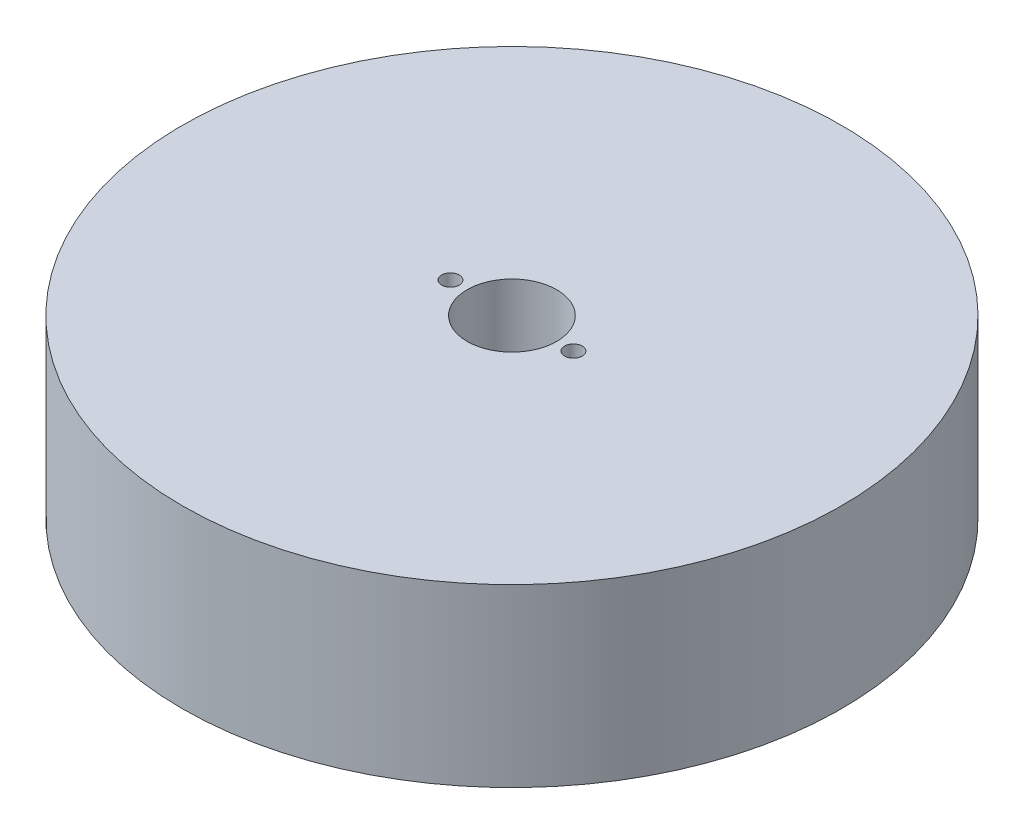
ISO-10303-21;
HEADER;
FILE_DESCRIPTION(('STEP AP214'),'2;1');
FILE_NAME('part.step','',(''),(''),'','','');
FILE_SCHEMA(('AUTOMOTIVE_DESIGN { 1 0 10303 214 1 1 1 1 }'));
ENDSEC;
DATA;
#1=APPLICATION_CONTEXT('core data for automotive mechanical design processes');
#2=APPLICATION_PROTOCOL_DEFINITION('international standard','automotive_design',2000,#1);
#3=PRODUCT_CONTEXT('',#1,'mechanical');
#4=PRODUCT('Part','Part','',(#3));
#5=PRODUCT_RELATED_PRODUCT_CATEGORY('part','',(#4));
#6=PRODUCT_DEFINITION_FORMATION('','',#4);
#7=PRODUCT_DEFINITION_CONTEXT('part definition',#1,'design');
#8=PRODUCT_DEFINITION('design','',#6,#7);
#9=PRODUCT_DEFINITION_SHAPE('','',#8);
#10=(LENGTH_UNIT() NAMED_UNIT(*) SI_UNIT(.MILLI.,.METRE.));
#11=(NAMED_UNIT(*) PLANE_ANGLE_UNIT() SI_UNIT($,.RADIAN.));
#12=(NAMED_UNIT(*) SI_UNIT($,.STERADIAN.) SOLID_ANGLE_UNIT());
#13=UNCERTAINTY_MEASURE_WITH_UNIT(LENGTH_MEASURE(1.E-05),#10,'distance_accuracy_value','');
#14=(GEOMETRIC_REPRESENTATION_CONTEXT(3) GLOBAL_UNCERTAINTY_ASSIGNED_CONTEXT((#13)) GLOBAL_UNIT_ASSIGNED_CONTEXT((#10,
#11,#12)) REPRESENTATION_CONTEXT('',''));
#15=CARTESIAN_POINT('',(0.,0.,0.));
#16=DIRECTION('',(0.,0.,1.));
#17=DIRECTION('',(1.,0.,0.));
#18=AXIS2_PLACEMENT_3D('',#15,#16,#17);
#19=CARTESIAN_POINT('',(0.,20.,0.));
#20=DIRECTION('',(0.,1.,0.));
#21=DIRECTION('',(0.,0.,1.));
#22=AXIS2_PLACEMENT_3D('',#19,#20,#21);
#23=PLANE('',#22);
#24=CARTESIAN_POINT('',(-7.,20.,0.));
#25=DIRECTION('',(0.,1.,0.));
#26=DIRECTION('',(0.,0.,1.));
#27=AXIS2_PLACEMENT_3D('',#24,#25,#26);
#28=CIRCLE('',#27,1.);
#29=CARTESIAN_POINT('',(-7.,20.,1.));
#30=VERTEX_POINT('',#29);
#31=EDGE_CURVE('E73',#30,#30,#28,.T.);
#32=ORIENTED_EDGE('',*,*,#31,.F.);
#33=EDGE_LOOP('',(#32));
#34=FACE_BOUND('',#33,.T.);
#35=CARTESIAN_POINT('',(0.,20.,0.));
#36=DIRECTION('',(0.,1.,0.));
#37=DIRECTION('',(0.,0.,1.));
#38=AXIS2_PLACEMENT_3D('',#35,#36,#37);
#39=CIRCLE('',#38,37.5);
#40=CARTESIAN_POINT('',(0.,20.,37.5));
#41=VERTEX_POINT('',#40);
#42=EDGE_CURVE('E12',#41,#41,#39,.T.);
#43=ORIENTED_EDGE('',*,*,#42,.T.);
#44=EDGE_LOOP('',(#43));
#45=FACE_BOUND('',#44,.T.);
#46=CARTESIAN_POINT('',(0.,20.,0.));
#47=DIRECTION('',(0.,1.,0.));
#48=DIRECTION('',(0.,0.,1.));
#49=AXIS2_PLACEMENT_3D('',#46,#47,#48);
#50=CIRCLE('',#49,5.1);
#51=CARTESIAN_POINT('',(0.,20.,5.1));
#52=VERTEX_POINT('',#51);
#53=EDGE_CURVE('E67',#52,#52,#50,.T.);
#54=ORIENTED_EDGE('',*,*,#53,.F.);
#55=EDGE_LOOP('',(#54));
#56=FACE_BOUND('',#55,.T.);
#57=CARTESIAN_POINT('',(7.,20.,0.));
#58=DIRECTION('',(0.,1.,0.));
#59=DIRECTION('',(0.,0.,1.));
#60=AXIS2_PLACEMENT_3D('',#57,#58,#59);
#61=CIRCLE('',#60,1.);
#62=CARTESIAN_POINT('',(7.,20.,1.));
#63=VERTEX_POINT('',#62);
#64=EDGE_CURVE('E81',#63,#63,#61,.T.);
#65=ORIENTED_EDGE('',*,*,#64,.F.);
#66=EDGE_LOOP('',(#65));
#67=FACE_BOUND('',#66,.T.);
#68=ADVANCED_FACE('F52',(#34,#45,#56,#67),#23,.T.);
#69=CARTESIAN_POINT('',(0.,0.,0.));
#70=DIRECTION('',(0.,1.,0.));
#71=DIRECTION('',(0.,0.,1.));
#72=AXIS2_PLACEMENT_3D('',#69,#70,#71);
#73=PLANE('',#72);
#74=CARTESIAN_POINT('',(0.,0.,0.));
#75=DIRECTION('',(0.,1.,0.));
#76=DIRECTION('',(0.,0.,1.));
#77=AXIS2_PLACEMENT_3D('',#74,#75,#76);
#78=CIRCLE('',#77,37.5);
#79=CARTESIAN_POINT('',(0.,0.,37.5));
#80=VERTEX_POINT('',#79);
#81=EDGE_CURVE('E56',#80,#80,#78,.T.);
#82=ORIENTED_EDGE('',*,*,#81,.F.);
#83=EDGE_LOOP('',(#82));
#84=FACE_BOUND('',#83,.T.);
#85=CARTESIAN_POINT('',(0.,0.,0.));
#86=DIRECTION('',(0.,1.,0.));
#87=DIRECTION('',(0.,0.,1.));
#88=AXIS2_PLACEMENT_3D('',#85,#86,#87);
#89=CIRCLE('',#88,5.1);
#90=CARTESIAN_POINT('',(0.,0.,5.1));
#91=VERTEX_POINT('',#90);
#92=EDGE_CURVE('E69',#91,#91,#89,.T.);
#93=ORIENTED_EDGE('',*,*,#92,.T.);
#94=EDGE_LOOP('',(#93));
#95=FACE_BOUND('',#94,.T.);
#96=CARTESIAN_POINT('',(-7.,0.,0.));
#97=DIRECTION('',(0.,1.,0.));
#98=DIRECTION('',(0.,0.,1.));
#99=AXIS2_PLACEMENT_3D('',#96,#97,#98);
#100=CIRCLE('',#99,1.);
#101=CARTESIAN_POINT('',(-7.,0.,1.));
#102=VERTEX_POINT('',#101);
#103=EDGE_CURVE('E77',#102,#102,#100,.T.);
#104=ORIENTED_EDGE('',*,*,#103,.T.);
#105=EDGE_LOOP('',(#104));
#106=FACE_BOUND('',#105,.T.);
#107=CARTESIAN_POINT('',(7.,0.,0.));
#108=DIRECTION('',(0.,1.,0.));
#109=DIRECTION('',(0.,0.,1.));
#110=AXIS2_PLACEMENT_3D('',#107,#108,#109);
#111=CIRCLE('',#110,1.);
#112=CARTESIAN_POINT('',(7.,0.,1.));
#113=VERTEX_POINT('',#112);
#114=EDGE_CURVE('E85',#113,#113,#111,.T.);
#115=ORIENTED_EDGE('',*,*,#114,.T.);
#116=EDGE_LOOP('',(#115));
#117=FACE_BOUND('',#116,.T.);
#118=ADVANCED_FACE('F99',(#84,#95,#106,#117),#73,.F.);
#119=CARTESIAN_POINT('',(0.,20.,0.));
#120=DIRECTION('',(0.,-1.,0.));
#121=DIRECTION('',(0.,0.,-1.));
#122=AXIS2_PLACEMENT_3D('',#119,#120,#121);
#123=CYLINDRICAL_SURFACE('',#122,37.5);
#124=ORIENTED_EDGE('',*,*,#42,.F.);
#125=EDGE_LOOP('',(#124));
#126=FACE_BOUND('',#125,.T.);
#127=ORIENTED_EDGE('',*,*,#81,.T.);
#128=EDGE_LOOP('',(#127));
#129=FACE_BOUND('',#128,.T.);
#130=ADVANCED_FACE('F54',(#126,#129),#123,.T.);
#131=CARTESIAN_POINT('',(0.,20.,0.));
#132=DIRECTION('',(0.,-1.,0.));
#133=DIRECTION('',(0.,0.,-1.));
#134=AXIS2_PLACEMENT_3D('',#131,#132,#133);
#135=CYLINDRICAL_SURFACE('',#134,5.1);
#136=ORIENTED_EDGE('',*,*,#53,.T.);
#137=EDGE_LOOP('',(#136));
#138=FACE_BOUND('',#137,.T.);
#139=ORIENTED_EDGE('',*,*,#92,.F.);
#140=EDGE_LOOP('',(#139));
#141=FACE_BOUND('',#140,.T.);
#142=ADVANCED_FACE('F108',(#138,#141),#135,.F.);
#143=CARTESIAN_POINT('',(-7.,20.,0.));
#144=DIRECTION('',(0.,-1.,0.));
#145=DIRECTION('',(0.,0.,-1.));
#146=AXIS2_PLACEMENT_3D('',#143,#144,#145);
#147=CYLINDRICAL_SURFACE('',#146,1.);
#148=ORIENTED_EDGE('',*,*,#31,.T.);
#149=EDGE_LOOP('',(#148));
#150=FACE_BOUND('',#149,.T.);
#151=ORIENTED_EDGE('',*,*,#103,.F.);
#152=EDGE_LOOP('',(#151));
#153=FACE_BOUND('',#152,.T.);
#154=ADVANCED_FACE('F111',(#150,#153),#147,.F.);
#155=CARTESIAN_POINT('',(7.,20.,0.));
#156=DIRECTION('',(0.,-1.,0.));
#157=DIRECTION('',(0.,0.,-1.));
#158=AXIS2_PLACEMENT_3D('',#155,#156,#157);
#159=CYLINDRICAL_SURFACE('',#158,1.);
#160=ORIENTED_EDGE('',*,*,#64,.T.);
#161=EDGE_LOOP('',(#160));
#162=FACE_BOUND('',#161,.T.);
#163=ORIENTED_EDGE('',*,*,#114,.F.);
#164=EDGE_LOOP('',(#163));
#165=FACE_BOUND('',#164,.T.);
#166=ADVANCED_FACE('F95',(#162,#165),#159,.F.);
#167=CLOSED_SHELL('',(#68,#118,#130,#142,#154,#166));
#168=MANIFOLD_SOLID_BREP('B2',#167);
#169=ADVANCED_BREP_SHAPE_REPRESENTATION('',(#18,#168),#14);
#170=SHAPE_DEFINITION_REPRESENTATION(#9,#169);
ENDSEC;
END-ISO-10303-21;
